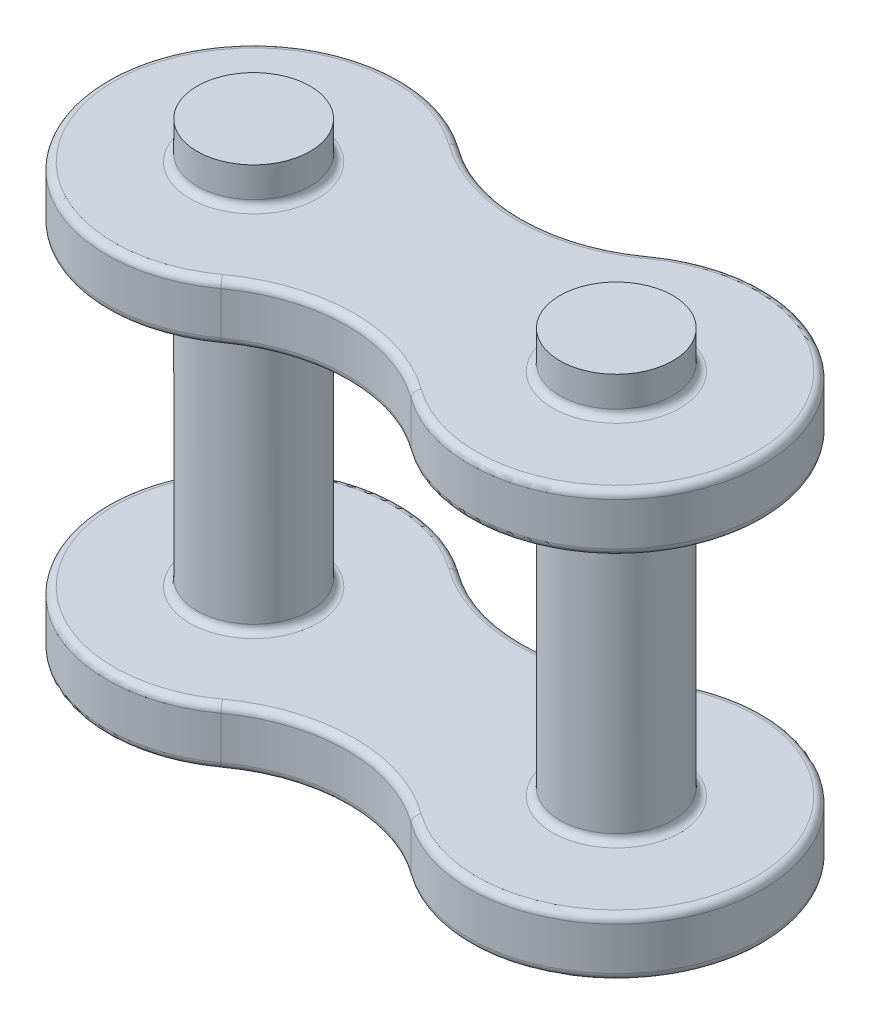
ISO-10303-21;
HEADER;
FILE_DESCRIPTION(('STEP AP214'),'2;1');
FILE_NAME('part.step','',(''),(''),'','','');
FILE_SCHEMA(('AUTOMOTIVE_DESIGN { 1 0 10303 214 1 1 1 1 }'));
ENDSEC;
DATA;
#1=APPLICATION_CONTEXT('core data for automotive mechanical design processes');
#2=APPLICATION_PROTOCOL_DEFINITION('international standard','automotive_design',2000,#1);
#3=PRODUCT_CONTEXT('',#1,'mechanical');
#4=PRODUCT('Part','Part','',(#3));
#5=PRODUCT_RELATED_PRODUCT_CATEGORY('part','',(#4));
#6=PRODUCT_DEFINITION_FORMATION('','',#4);
#7=PRODUCT_DEFINITION_CONTEXT('part definition',#1,'design');
#8=PRODUCT_DEFINITION('design','',#6,#7);
#9=PRODUCT_DEFINITION_SHAPE('','',#8);
#10=(LENGTH_UNIT() NAMED_UNIT(*) SI_UNIT(.MILLI.,.METRE.));
#11=(NAMED_UNIT(*) PLANE_ANGLE_UNIT() SI_UNIT($,.RADIAN.));
#12=(NAMED_UNIT(*) SI_UNIT($,.STERADIAN.) SOLID_ANGLE_UNIT());
#13=UNCERTAINTY_MEASURE_WITH_UNIT(LENGTH_MEASURE(1.E-05),#10,'distance_accuracy_value','');
#14=(GEOMETRIC_REPRESENTATION_CONTEXT(3) GLOBAL_UNCERTAINTY_ASSIGNED_CONTEXT((#13)) GLOBAL_UNIT_ASSIGNED_CONTEXT((#10,
#11,#12)) REPRESENTATION_CONTEXT('',''));
#15=CARTESIAN_POINT('',(0.,0.,0.));
#16=DIRECTION('',(0.,0.,1.));
#17=DIRECTION('',(1.,0.,0.));
#18=AXIS2_PLACEMENT_3D('',#15,#16,#17);
#19=CARTESIAN_POINT('',(3.175,1.0033,-4.37563141450818));
#20=DIRECTION('',(0.,1.,0.));
#21=DIRECTION('',(0.,0.,1.));
#22=AXIS2_PLACEMENT_3D('',#19,#20,#21);
#23=PLANE('',#22);
#24=CARTESIAN_POINT('',(6.35,1.0033,0.));
#25=DIRECTION('',(0.,1.,0.));
#26=DIRECTION('',(0.,0.,1.));
#27=AXIS2_PLACEMENT_3D('',#24,#25,#26);
#28=CIRCLE('',#27,2.234);
#29=CARTESIAN_POINT('',(6.35,1.0033,2.234));
#30=VERTEX_POINT('',#29);
#31=EDGE_CURVE('E278',#30,#30,#28,.F.);
#32=ORIENTED_EDGE('',*,*,#31,.T.);
#33=EDGE_LOOP('',(#32));
#34=FACE_BOUND('',#33,.T.);
#35=CARTESIAN_POINT('',(-6.35,1.0033,0.));
#36=DIRECTION('',(0.,1.,0.));
#37=DIRECTION('',(0.,0.,1.));
#38=AXIS2_PLACEMENT_3D('',#35,#36,#37);
#39=CIRCLE('',#38,2.234);
#40=CARTESIAN_POINT('',(-6.35,1.0033,2.234));
#41=VERTEX_POINT('',#40);
#42=EDGE_CURVE('E274',#41,#41,#39,.F.);
#43=ORIENTED_EDGE('',*,*,#42,.T.);
#44=EDGE_LOOP('',(#43));
#45=FACE_BOUND('',#44,.T.);
#46=CARTESIAN_POINT('',(6.35,1.0033,0.));
#47=DIRECTION('',(0.,1.,0.));
#48=DIRECTION('',(0.,0.,1.));
#49=AXIS2_PLACEMENT_3D('',#46,#47,#48);
#50=CIRCLE('',#49,4.8895);
#51=CARTESIAN_POINT('',(3.47844109205325,1.0033,3.95744357991263));
#52=VERTEX_POINT('',#51);
#53=CARTESIAN_POINT('',(3.47844109205325,1.0033,-3.95744357991263));
#54=VERTEX_POINT('',#53);
#55=EDGE_CURVE('E269',#52,#54,#50,.T.);
#56=ORIENTED_EDGE('',*,*,#55,.T.);
#57=CARTESIAN_POINT('',(0.,1.0033,-8.75126282901636));
#58=DIRECTION('',(0.,1.,0.));
#59=DIRECTION('',(0.,0.,1.));
#60=AXIS2_PLACEMENT_3D('',#57,#58,#59);
#61=CIRCLE('',#60,5.92285872058097);
#62=CARTESIAN_POINT('',(-3.47844109205325,1.0033,-3.95744357991263));
#63=VERTEX_POINT('',#62);
#64=EDGE_CURVE('E177',#54,#63,#61,.F.);
#65=ORIENTED_EDGE('',*,*,#64,.T.);
#66=CARTESIAN_POINT('',(-6.35,1.0033,0.));
#67=DIRECTION('',(0.,1.,0.));
#68=DIRECTION('',(0.,0.,1.));
#69=AXIS2_PLACEMENT_3D('',#66,#67,#68);
#70=CIRCLE('',#69,4.8895);
#71=CARTESIAN_POINT('',(-3.47844109205325,1.0033,3.95744357991263));
#72=VERTEX_POINT('',#71);
#73=EDGE_CURVE('E263',#63,#72,#70,.T.);
#74=ORIENTED_EDGE('',*,*,#73,.T.);
#75=CARTESIAN_POINT('',(0.,1.0033,8.75126282901636));
#76=DIRECTION('',(0.,1.,0.));
#77=DIRECTION('',(0.,0.,1.));
#78=AXIS2_PLACEMENT_3D('',#75,#76,#77);
#79=CIRCLE('',#78,5.92285872058097);
#80=EDGE_CURVE('E266',#72,#52,#79,.F.);
#81=ORIENTED_EDGE('',*,*,#80,.T.);
#82=EDGE_LOOP('',(#56,#65,#74,#81));
#83=FACE_BOUND('',#82,.T.);
#84=ADVANCED_FACE('F51',(#34,#45,#83),#23,.T.);
#85=CARTESIAN_POINT('',(3.175,-1.0033,-4.37563141450818));
#86=DIRECTION('',(0.,1.,0.));
#87=DIRECTION('',(0.,0.,1.));
#88=AXIS2_PLACEMENT_3D('',#85,#86,#87);
#89=PLANE('',#88);
#90=CARTESIAN_POINT('',(-6.35,-1.0033,0.));
#91=DIRECTION('',(0.,1.,0.));
#92=DIRECTION('',(0.,0.,1.));
#93=AXIS2_PLACEMENT_3D('',#90,#91,#92);
#94=CIRCLE('',#93,2.234);
#95=CARTESIAN_POINT('',(-6.35,-1.0033,2.234));
#96=VERTEX_POINT('',#95);
#97=EDGE_CURVE('E247',#96,#96,#94,.T.);
#98=ORIENTED_EDGE('',*,*,#97,.T.);
#99=EDGE_LOOP('',(#98));
#100=FACE_BOUND('',#99,.T.);
#101=CARTESIAN_POINT('',(6.35,-1.0033,0.));
#102=DIRECTION('',(0.,1.,0.));
#103=DIRECTION('',(0.,0.,1.));
#104=AXIS2_PLACEMENT_3D('',#101,#102,#103);
#105=CIRCLE('',#104,2.234);
#106=CARTESIAN_POINT('',(6.35,-1.0033,2.234));
#107=VERTEX_POINT('',#106);
#108=EDGE_CURVE('E243',#107,#107,#105,.T.);
#109=ORIENTED_EDGE('',*,*,#108,.T.);
#110=EDGE_LOOP('',(#109));
#111=FACE_BOUND('',#110,.T.);
#112=CARTESIAN_POINT('',(0.,-1.0033,-8.75126282901636));
#113=DIRECTION('',(0.,1.,0.));
#114=DIRECTION('',(0.,0.,1.));
#115=AXIS2_PLACEMENT_3D('',#112,#113,#114);
#116=CIRCLE('',#115,5.92285872058097);
#117=CARTESIAN_POINT('',(-3.47844109205325,-1.0033,-3.95744357991263));
#118=VERTEX_POINT('',#117);
#119=CARTESIAN_POINT('',(3.47844109205325,-1.0033,-3.95744357991263));
#120=VERTEX_POINT('',#119);
#121=EDGE_CURVE('E230',#118,#120,#116,.T.);
#122=ORIENTED_EDGE('',*,*,#121,.T.);
#123=CARTESIAN_POINT('',(6.35,-1.0033,0.));
#124=DIRECTION('',(0.,1.,0.));
#125=DIRECTION('',(0.,0.,1.));
#126=AXIS2_PLACEMENT_3D('',#123,#124,#125);
#127=CIRCLE('',#126,4.8895);
#128=CARTESIAN_POINT('',(3.47844109205325,-1.0033,3.95744357991263));
#129=VERTEX_POINT('',#128);
#130=EDGE_CURVE('E239',#120,#129,#127,.F.);
#131=ORIENTED_EDGE('',*,*,#130,.T.);
#132=CARTESIAN_POINT('',(0.,-1.0033,8.75126282901636));
#133=DIRECTION('',(0.,1.,0.));
#134=DIRECTION('',(0.,0.,1.));
#135=AXIS2_PLACEMENT_3D('',#132,#133,#134);
#136=CIRCLE('',#135,5.92285872058097);
#137=CARTESIAN_POINT('',(-3.47844109205325,-1.0033,3.95744357991263));
#138=VERTEX_POINT('',#137);
#139=EDGE_CURVE('E236',#129,#138,#136,.T.);
#140=ORIENTED_EDGE('',*,*,#139,.T.);
#141=CARTESIAN_POINT('',(-6.35,-1.0033,0.));
#142=DIRECTION('',(0.,1.,0.));
#143=DIRECTION('',(0.,0.,1.));
#144=AXIS2_PLACEMENT_3D('',#141,#142,#143);
#145=CIRCLE('',#144,4.8895);
#146=EDGE_CURVE('E233',#138,#118,#145,.F.);
#147=ORIENTED_EDGE('',*,*,#146,.T.);
#148=EDGE_LOOP('',(#122,#131,#140,#147));
#149=FACE_BOUND('',#148,.T.);
#150=ADVANCED_FACE('F492',(#100,#111,#149),#89,.F.);
#151=CARTESIAN_POINT('',(0.,1.0033,-8.75126282901636));
#152=DIRECTION('',(0.,-1.,0.));
#153=DIRECTION('',(0.,0.,-1.));
#154=AXIS2_PLACEMENT_3D('',#151,#152,#153);
#155=CYLINDRICAL_SURFACE('',#154,5.66885872058097);
#156=DIRECTION('',(0.,-1.,0.));
#157=VECTOR('',#156,1.);
#158=CARTESIAN_POINT('',(-3.32926920073134,1.0033,-4.16302506458341));
#159=LINE('',#158,#157);
#160=CARTESIAN_POINT('',(-3.32926920073134,0.7493,-4.16302506458341));
#161=VERTEX_POINT('',#160);
#162=CARTESIAN_POINT('',(-3.32926920073134,-0.7493,-4.16302506458341));
#163=VERTEX_POINT('',#162);
#164=EDGE_CURVE('E195',#161,#163,#159,.T.);
#165=ORIENTED_EDGE('',*,*,#164,.F.);
#166=CARTESIAN_POINT('',(0.,0.7493,-8.75126282901636));
#167=DIRECTION('',(0.,1.,0.));
#168=DIRECTION('',(0.,0.,1.));
#169=AXIS2_PLACEMENT_3D('',#166,#167,#168);
#170=CIRCLE('',#169,5.66885872058097);
#171=CARTESIAN_POINT('',(3.32926920073134,0.7493,-4.16302506458341));
#172=VERTEX_POINT('',#171);
#173=EDGE_CURVE('E174',#161,#172,#170,.T.);
#174=ORIENTED_EDGE('',*,*,#173,.T.);
#175=DIRECTION('',(0.,-1.,0.));
#176=VECTOR('',#175,1.);
#177=CARTESIAN_POINT('',(3.32926920073134,1.0033,-4.16302506458341));
#178=LINE('',#177,#176);
#179=CARTESIAN_POINT('',(3.32926920073134,-0.7493,-4.16302506458341));
#180=VERTEX_POINT('',#179);
#181=EDGE_CURVE('E201',#172,#180,#178,.T.);
#182=ORIENTED_EDGE('',*,*,#181,.T.);
#183=CARTESIAN_POINT('',(0.,-0.7493,-8.75126282901636));
#184=DIRECTION('',(0.,1.,0.));
#185=DIRECTION('',(0.,0.,1.));
#186=AXIS2_PLACEMENT_3D('',#183,#184,#185);
#187=CIRCLE('',#186,5.66885872058097);
#188=EDGE_CURVE('E205',#180,#163,#187,.F.);
#189=ORIENTED_EDGE('',*,*,#188,.T.);
#190=EDGE_LOOP('',(#165,#174,#182,#189));
#191=FACE_BOUND('',#190,.T.);
#192=ADVANCED_FACE('F200',(#191),#155,.F.);
#193=CARTESIAN_POINT('',(-6.35,1.0033,0.));
#194=DIRECTION('',(0.,-1.,0.));
#195=DIRECTION('',(0.,0.,-1.));
#196=AXIS2_PLACEMENT_3D('',#193,#194,#195);
#197=CYLINDRICAL_SURFACE('',#196,5.1435);
#198=ORIENTED_EDGE('',*,*,#164,.T.);
#199=CARTESIAN_POINT('',(-6.35,-0.7493,0.));
#200=DIRECTION('',(0.,1.,0.));
#201=DIRECTION('',(0.,0.,1.));
#202=AXIS2_PLACEMENT_3D('',#199,#200,#201);
#203=CIRCLE('',#202,5.1435);
#204=CARTESIAN_POINT('',(-3.32926920073134,-0.7493,4.16302506458341));
#205=VERTEX_POINT('',#204);
#206=EDGE_CURVE('E260',#163,#205,#203,.T.);
#207=ORIENTED_EDGE('',*,*,#206,.T.);
#208=DIRECTION('',(0.,-1.,0.));
#209=VECTOR('',#208,1.);
#210=CARTESIAN_POINT('',(-3.32926920073134,1.0033,4.16302506458341));
#211=LINE('',#210,#209);
#212=CARTESIAN_POINT('',(-3.32926920073134,0.7493,4.16302506458341));
#213=VERTEX_POINT('',#212);
#214=EDGE_CURVE('E216',#213,#205,#211,.T.);
#215=ORIENTED_EDGE('',*,*,#214,.F.);
#216=CARTESIAN_POINT('',(-6.35,0.7493,0.));
#217=DIRECTION('',(0.,1.,0.));
#218=DIRECTION('',(0.,0.,1.));
#219=AXIS2_PLACEMENT_3D('',#216,#217,#218);
#220=CIRCLE('',#219,5.1435);
#221=EDGE_CURVE('E257',#213,#161,#220,.F.);
#222=ORIENTED_EDGE('',*,*,#221,.T.);
#223=EDGE_LOOP('',(#198,#207,#215,#222));
#224=FACE_BOUND('',#223,.T.);
#225=ADVANCED_FACE('F509',(#224),#197,.T.);
#226=CARTESIAN_POINT('',(0.,1.0033,8.75126282901636));
#227=DIRECTION('',(0.,-1.,0.));
#228=DIRECTION('',(0.,0.,-1.));
#229=AXIS2_PLACEMENT_3D('',#226,#227,#228);
#230=CYLINDRICAL_SURFACE('',#229,5.66885872058097);
#231=ORIENTED_EDGE('',*,*,#214,.T.);
#232=CARTESIAN_POINT('',(0.,-0.7493,8.75126282901636));
#233=DIRECTION('',(0.,1.,0.));
#234=DIRECTION('',(0.,0.,1.));
#235=AXIS2_PLACEMENT_3D('',#232,#233,#234);
#236=CIRCLE('',#235,5.66885872058097);
#237=CARTESIAN_POINT('',(3.32926920073134,-0.7493,4.16302506458341));
#238=VERTEX_POINT('',#237);
#239=EDGE_CURVE('E254',#205,#238,#236,.F.);
#240=ORIENTED_EDGE('',*,*,#239,.T.);
#241=DIRECTION('',(0.,-1.,0.));
#242=VECTOR('',#241,1.);
#243=CARTESIAN_POINT('',(3.32926920073134,1.0033,4.16302506458341));
#244=LINE('',#243,#242);
#245=CARTESIAN_POINT('',(3.32926920073134,0.7493,4.16302506458341));
#246=VERTEX_POINT('',#245);
#247=EDGE_CURVE('E211',#246,#238,#244,.T.);
#248=ORIENTED_EDGE('',*,*,#247,.F.);
#249=CARTESIAN_POINT('',(0.,0.7493,8.75126282901636));
#250=DIRECTION('',(0.,1.,0.));
#251=DIRECTION('',(0.,0.,1.));
#252=AXIS2_PLACEMENT_3D('',#249,#250,#251);
#253=CIRCLE('',#252,5.66885872058097);
#254=EDGE_CURVE('E251',#246,#213,#253,.T.);
#255=ORIENTED_EDGE('',*,*,#254,.T.);
#256=EDGE_LOOP('',(#231,#240,#248,#255));
#257=FACE_BOUND('',#256,.T.);
#258=ADVANCED_FACE('F506',(#257),#230,.F.);
#259=CARTESIAN_POINT('',(6.35,1.0033,0.));
#260=DIRECTION('',(0.,-1.,0.));
#261=DIRECTION('',(0.,0.,-1.));
#262=AXIS2_PLACEMENT_3D('',#259,#260,#261);
#263=CYLINDRICAL_SURFACE('',#262,5.1435);
#264=ORIENTED_EDGE('',*,*,#247,.T.);
#265=CARTESIAN_POINT('',(6.35,-0.7493,0.));
#266=DIRECTION('',(0.,1.,0.));
#267=DIRECTION('',(0.,0.,1.));
#268=AXIS2_PLACEMENT_3D('',#265,#266,#267);
#269=CIRCLE('',#268,5.1435);
#270=EDGE_CURVE('E194',#238,#180,#269,.T.);
#271=ORIENTED_EDGE('',*,*,#270,.T.);
#272=ORIENTED_EDGE('',*,*,#181,.F.);
#273=CARTESIAN_POINT('',(6.35,0.7493,0.));
#274=DIRECTION('',(0.,1.,0.));
#275=DIRECTION('',(0.,0.,1.));
#276=AXIS2_PLACEMENT_3D('',#273,#274,#275);
#277=CIRCLE('',#276,5.1435);
#278=EDGE_CURVE('E185',#172,#246,#277,.F.);
#279=ORIENTED_EDGE('',*,*,#278,.T.);
#280=EDGE_LOOP('',(#264,#271,#272,#279));
#281=FACE_BOUND('',#280,.T.);
#282=ADVANCED_FACE('F208',(#281),#263,.T.);
#283=CARTESIAN_POINT('',(-6.35,-2.3114,0.));
#284=DIRECTION('',(0.,1.,0.));
#285=DIRECTION('',(0.,0.,1.));
#286=AXIS2_PLACEMENT_3D('',#283,#284,#285);
#287=PLANE('',#286);
#288=CARTESIAN_POINT('',(-6.35,-2.3114,0.));
#289=DIRECTION('',(0.,1.,0.));
#290=DIRECTION('',(0.,0.,1.));
#291=AXIS2_PLACEMENT_3D('',#288,#289,#290);
#292=CIRCLE('',#291,1.98);
#293=CARTESIAN_POINT('',(-6.35,-2.3114,1.98));
#294=VERTEX_POINT('',#293);
#295=EDGE_CURVE('E219',#294,#294,#292,.T.);
#296=ORIENTED_EDGE('',*,*,#295,.F.);
#297=EDGE_LOOP('',(#296));
#298=FACE_BOUND('',#297,.T.);
#299=ADVANCED_FACE('F505',(#298),#287,.F.);
#300=CARTESIAN_POINT('',(-6.35,15.1892,0.));
#301=DIRECTION('',(0.,-1.,0.));
#302=DIRECTION('',(0.,0.,-1.));
#303=AXIS2_PLACEMENT_3D('',#300,#301,#302);
#304=CYLINDRICAL_SURFACE('',#303,1.98);
#305=CARTESIAN_POINT('',(-6.35,-1.2573,0.));
#306=DIRECTION('',(0.,1.,0.));
#307=DIRECTION('',(0.,0.,1.));
#308=AXIS2_PLACEMENT_3D('',#305,#306,#307);
#309=CIRCLE('',#308,1.98);
#310=CARTESIAN_POINT('',(-6.35,-1.2573,1.98));
#311=VERTEX_POINT('',#310);
#312=EDGE_CURVE('E204',#311,#311,#309,.F.);
#313=ORIENTED_EDGE('',*,*,#312,.T.);
#314=EDGE_LOOP('',(#313));
#315=FACE_BOUND('',#314,.T.);
#316=ORIENTED_EDGE('',*,*,#295,.T.);
#317=EDGE_LOOP('',(#316));
#318=FACE_BOUND('',#317,.T.);
#319=ADVANCED_FACE('F486',(#315,#318),#304,.T.);
#320=CARTESIAN_POINT('',(-6.35,11.6205,0.));
#321=DIRECTION('',(0.,-1.,0.));
#322=DIRECTION('',(0.,0.,-1.));
#323=AXIS2_PLACEMENT_3D('',#320,#321,#322);
#324=CIRCLE('',#323,1.98);
#325=CARTESIAN_POINT('',(-6.35,11.6205,-1.98));
#326=VERTEX_POINT('',#325);
#327=EDGE_CURVE('E11',#326,#326,#324,.T.);
#328=ORIENTED_EDGE('',*,*,#327,.T.);
#329=EDGE_LOOP('',(#328));
#330=FACE_BOUND('',#329,.T.);
#331=CARTESIAN_POINT('',(-6.35,1.2573,0.));
#332=DIRECTION('',(0.,1.,0.));
#333=DIRECTION('',(0.,0.,1.));
#334=AXIS2_PLACEMENT_3D('',#331,#332,#333);
#335=CIRCLE('',#334,1.98);
#336=CARTESIAN_POINT('',(-6.35,1.2573,1.98));
#337=VERTEX_POINT('',#336);
#338=EDGE_CURVE('E295',#337,#337,#335,.T.);
#339=ORIENTED_EDGE('',*,*,#338,.T.);
#340=EDGE_LOOP('',(#339));
#341=FACE_BOUND('',#340,.T.);
#342=ADVANCED_FACE('F474',(#330,#341),#304,.T.);
#343=CARTESIAN_POINT('',(6.35,-2.3114,0.));
#344=DIRECTION('',(0.,-1.,0.));
#345=DIRECTION('',(0.,0.,-1.));
#346=AXIS2_PLACEMENT_3D('',#343,#344,#345);
#347=PLANE('',#346);
#348=CARTESIAN_POINT('',(6.35,-2.3114,0.));
#349=DIRECTION('',(0.,1.,0.));
#350=DIRECTION('',(0.,0.,-1.));
#351=AXIS2_PLACEMENT_3D('',#348,#349,#350);
#352=CIRCLE('',#351,1.98);
#353=CARTESIAN_POINT('',(6.35,-2.3114,-1.98));
#354=VERTEX_POINT('',#353);
#355=EDGE_CURVE('E314',#354,#354,#352,.T.);
#356=ORIENTED_EDGE('',*,*,#355,.F.);
#357=EDGE_LOOP('',(#356));
#358=FACE_BOUND('',#357,.T.);
#359=ADVANCED_FACE('F472',(#358),#347,.T.);
#360=CARTESIAN_POINT('',(6.35,15.1892,0.));
#361=DIRECTION('',(0.,-1.,0.));
#362=DIRECTION('',(0.,0.,-1.));
#363=AXIS2_PLACEMENT_3D('',#360,#361,#362);
#364=CYLINDRICAL_SURFACE('',#363,1.98);
#365=CARTESIAN_POINT('',(6.35,-1.2573,0.));
#366=DIRECTION('',(0.,1.,0.));
#367=DIRECTION('',(0.,0.,1.));
#368=AXIS2_PLACEMENT_3D('',#365,#366,#367);
#369=CIRCLE('',#368,1.98);
#370=CARTESIAN_POINT('',(6.35,-1.2573,1.98));
#371=VERTEX_POINT('',#370);
#372=EDGE_CURVE('E287',#371,#371,#369,.F.);
#373=ORIENTED_EDGE('',*,*,#372,.T.);
#374=EDGE_LOOP('',(#373));
#375=FACE_BOUND('',#374,.T.);
#376=ORIENTED_EDGE('',*,*,#355,.T.);
#377=EDGE_LOOP('',(#376));
#378=FACE_BOUND('',#377,.T.);
#379=ADVANCED_FACE('F470',(#375,#378),#364,.T.);
#380=CARTESIAN_POINT('',(6.35,11.6205,0.));
#381=DIRECTION('',(0.,-1.,0.));
#382=DIRECTION('',(0.,0.,-1.));
#383=AXIS2_PLACEMENT_3D('',#380,#381,#382);
#384=CIRCLE('',#383,1.98);
#385=CARTESIAN_POINT('',(6.35,11.6205,-1.98));
#386=VERTEX_POINT('',#385);
#387=EDGE_CURVE('E61',#386,#386,#384,.T.);
#388=ORIENTED_EDGE('',*,*,#387,.T.);
#389=EDGE_LOOP('',(#388));
#390=FACE_BOUND('',#389,.T.);
#391=CARTESIAN_POINT('',(6.35,1.2573,0.));
#392=DIRECTION('',(0.,1.,0.));
#393=DIRECTION('',(0.,0.,1.));
#394=AXIS2_PLACEMENT_3D('',#391,#392,#393);
#395=CIRCLE('',#394,1.98);
#396=CARTESIAN_POINT('',(6.35,1.2573,1.98));
#397=VERTEX_POINT('',#396);
#398=EDGE_CURVE('E291',#397,#397,#395,.T.);
#399=ORIENTED_EDGE('',*,*,#398,.T.);
#400=EDGE_LOOP('',(#399));
#401=FACE_BOUND('',#400,.T.);
#402=ADVANCED_FACE('F481',(#390,#401),#364,.T.);
#403=CARTESIAN_POINT('',(-6.35,-0.7493,0.));
#404=DIRECTION('',(0.,1.,0.));
#405=DIRECTION('',(0.,0.,1.));
#406=AXIS2_PLACEMENT_3D('',#403,#404,#405);
#407=TOROIDAL_SURFACE('',#406,4.8895,0.254);
#408=CARTESIAN_POINT('',(-3.47844109205325,-0.7493,-3.95744357991263));
#409=DIRECTION('',(0.809375923900732,0.,0.587290910716177));
#410=DIRECTION('',(0.587290910716177,0.,-0.809375923900732));
#411=AXIS2_PLACEMENT_3D('',#408,#409,#410);
#412=CIRCLE('',#411,0.254);
#413=EDGE_CURVE('E306',#118,#163,#412,.T.);
#414=ORIENTED_EDGE('',*,*,#413,.F.);
#415=ORIENTED_EDGE('',*,*,#146,.F.);
#416=CARTESIAN_POINT('',(-3.47844109205325,-0.7493,3.95744357991263));
#417=DIRECTION('',(0.809375923900732,0.,-0.587290910716177));
#418=DIRECTION('',(-0.587290910716177,0.,-0.809375923900732));
#419=AXIS2_PLACEMENT_3D('',#416,#417,#418);
#420=CIRCLE('',#419,0.254);
#421=EDGE_CURVE('E310',#205,#138,#420,.T.);
#422=ORIENTED_EDGE('',*,*,#421,.F.);
#423=ORIENTED_EDGE('',*,*,#206,.F.);
#424=EDGE_LOOP('',(#414,#415,#422,#423));
#425=FACE_BOUND('',#424,.T.);
#426=ADVANCED_FACE('F528',(#425),#407,.T.);
#427=CARTESIAN_POINT('',(0.,-0.7493,8.75126282901636));
#428=DIRECTION('',(0.,1.,0.));
#429=DIRECTION('',(0.,0.,1.));
#430=AXIS2_PLACEMENT_3D('',#427,#428,#429);
#431=TOROIDAL_SURFACE('',#430,5.92285872058097,0.254);
#432=ORIENTED_EDGE('',*,*,#421,.T.);
#433=ORIENTED_EDGE('',*,*,#139,.F.);
#434=CARTESIAN_POINT('',(3.47844109205325,-0.7493,3.95744357991263));
#435=DIRECTION('',(0.809375923900732,0.,0.587290910716177));
#436=DIRECTION('',(0.587290910716177,0.,-0.809375923900732));
#437=AXIS2_PLACEMENT_3D('',#434,#435,#436);
#438=CIRCLE('',#437,0.254);
#439=EDGE_CURVE('E303',#238,#129,#438,.T.);
#440=ORIENTED_EDGE('',*,*,#439,.F.);
#441=ORIENTED_EDGE('',*,*,#239,.F.);
#442=EDGE_LOOP('',(#432,#433,#440,#441));
#443=FACE_BOUND('',#442,.T.);
#444=ADVANCED_FACE('F524',(#443),#431,.T.);
#445=CARTESIAN_POINT('',(0.,-0.7493,-8.75126282901636));
#446=DIRECTION('',(0.,1.,0.));
#447=DIRECTION('',(0.,0.,1.));
#448=AXIS2_PLACEMENT_3D('',#445,#446,#447);
#449=TOROIDAL_SURFACE('',#448,5.92285872058097,0.254);
#450=ORIENTED_EDGE('',*,*,#413,.T.);
#451=ORIENTED_EDGE('',*,*,#188,.F.);
#452=CARTESIAN_POINT('',(3.47844109205325,-0.7493,-3.95744357991263));
#453=DIRECTION('',(0.809375923900732,0.,-0.587290910716177));
#454=DIRECTION('',(-0.587290910716177,0.,-0.809375923900732));
#455=AXIS2_PLACEMENT_3D('',#452,#453,#454);
#456=CIRCLE('',#455,0.254);
#457=EDGE_CURVE('E300',#120,#180,#456,.T.);
#458=ORIENTED_EDGE('',*,*,#457,.F.);
#459=ORIENTED_EDGE('',*,*,#121,.F.);
#460=EDGE_LOOP('',(#450,#451,#458,#459));
#461=FACE_BOUND('',#460,.T.);
#462=ADVANCED_FACE('F520',(#461),#449,.T.);
#463=CARTESIAN_POINT('',(6.35,-0.7493,0.));
#464=DIRECTION('',(0.,1.,0.));
#465=DIRECTION('',(0.,0.,1.));
#466=AXIS2_PLACEMENT_3D('',#463,#464,#465);
#467=TOROIDAL_SURFACE('',#466,4.8895,0.254);
#468=ORIENTED_EDGE('',*,*,#439,.T.);
#469=ORIENTED_EDGE('',*,*,#130,.F.);
#470=ORIENTED_EDGE('',*,*,#457,.T.);
#471=ORIENTED_EDGE('',*,*,#270,.F.);
#472=EDGE_LOOP('',(#468,#469,#470,#471));
#473=FACE_BOUND('',#472,.T.);
#474=ADVANCED_FACE('F516',(#473),#467,.T.);
#475=CARTESIAN_POINT('',(0.,0.7493,8.75126282901636));
#476=DIRECTION('',(0.,1.,0.));
#477=DIRECTION('',(0.,0.,1.));
#478=AXIS2_PLACEMENT_3D('',#475,#476,#477);
#479=TOROIDAL_SURFACE('',#478,5.92285872058097,0.254);
#480=CARTESIAN_POINT('',(-3.47844109205325,0.7493,3.95744357991263));
#481=DIRECTION('',(-0.809375923900732,0.,0.587290910716177));
#482=DIRECTION('',(0.587290910716177,0.,0.809375923900732));
#483=AXIS2_PLACEMENT_3D('',#480,#481,#482);
#484=CIRCLE('',#483,0.254);
#485=EDGE_CURVE('E181',#213,#72,#484,.T.);
#486=ORIENTED_EDGE('',*,*,#485,.F.);
#487=ORIENTED_EDGE('',*,*,#254,.F.);
#488=CARTESIAN_POINT('',(3.47844109205325,0.7493,3.95744357991263));
#489=DIRECTION('',(0.809375923900732,0.,0.587290910716177));
#490=DIRECTION('',(0.587290910716177,0.,-0.809375923900732));
#491=AXIS2_PLACEMENT_3D('',#488,#489,#490);
#492=CIRCLE('',#491,0.254);
#493=EDGE_CURVE('E188',#52,#246,#492,.T.);
#494=ORIENTED_EDGE('',*,*,#493,.F.);
#495=ORIENTED_EDGE('',*,*,#80,.F.);
#496=EDGE_LOOP('',(#486,#487,#494,#495));
#497=FACE_BOUND('',#496,.T.);
#498=ADVANCED_FACE('F519',(#497),#479,.T.);
#499=CARTESIAN_POINT('',(6.35,0.7493,0.));
#500=DIRECTION('',(0.,1.,0.));
#501=DIRECTION('',(0.,0.,1.));
#502=AXIS2_PLACEMENT_3D('',#499,#500,#501);
#503=TOROIDAL_SURFACE('',#502,4.8895,0.254);
#504=ORIENTED_EDGE('',*,*,#493,.T.);
#505=ORIENTED_EDGE('',*,*,#278,.F.);
#506=CARTESIAN_POINT('',(3.47844109205325,0.7493,-3.95744357991263));
#507=DIRECTION('',(-0.809375923900731,0.,0.587290910716178));
#508=DIRECTION('',(0.587290910716178,0.,0.809375923900731));
#509=AXIS2_PLACEMENT_3D('',#506,#507,#508);
#510=CIRCLE('',#509,0.254);
#511=EDGE_CURVE('E170',#54,#172,#510,.T.);
#512=ORIENTED_EDGE('',*,*,#511,.F.);
#513=ORIENTED_EDGE('',*,*,#55,.F.);
#514=EDGE_LOOP('',(#504,#505,#512,#513));
#515=FACE_BOUND('',#514,.T.);
#516=ADVANCED_FACE('F186',(#515),#503,.T.);
#517=CARTESIAN_POINT('',(-6.35,0.7493,0.));
#518=DIRECTION('',(0.,1.,0.));
#519=DIRECTION('',(0.,0.,1.));
#520=AXIS2_PLACEMENT_3D('',#517,#518,#519);
#521=TOROIDAL_SURFACE('',#520,4.8895,0.254);
#522=ORIENTED_EDGE('',*,*,#485,.T.);
#523=ORIENTED_EDGE('',*,*,#73,.F.);
#524=CARTESIAN_POINT('',(-3.47844109205325,0.7493,-3.95744357991263));
#525=DIRECTION('',(0.809375923900732,0.,0.587290910716177));
#526=DIRECTION('',(0.587290910716177,0.,-0.809375923900732));
#527=AXIS2_PLACEMENT_3D('',#524,#525,#526);
#528=CIRCLE('',#527,0.254);
#529=EDGE_CURVE('E182',#161,#63,#528,.T.);
#530=ORIENTED_EDGE('',*,*,#529,.F.);
#531=ORIENTED_EDGE('',*,*,#221,.F.);
#532=EDGE_LOOP('',(#522,#523,#530,#531));
#533=FACE_BOUND('',#532,.T.);
#534=ADVANCED_FACE('F536',(#533),#521,.T.);
#535=CARTESIAN_POINT('',(0.,0.7493,-8.75126282901636));
#536=DIRECTION('',(0.,1.,0.));
#537=DIRECTION('',(0.,0.,1.));
#538=AXIS2_PLACEMENT_3D('',#535,#536,#537);
#539=TOROIDAL_SURFACE('',#538,5.92285872058097,0.254);
#540=ORIENTED_EDGE('',*,*,#511,.T.);
#541=ORIENTED_EDGE('',*,*,#173,.F.);
#542=ORIENTED_EDGE('',*,*,#529,.T.);
#543=ORIENTED_EDGE('',*,*,#64,.F.);
#544=EDGE_LOOP('',(#540,#541,#542,#543));
#545=FACE_BOUND('',#544,.T.);
#546=ADVANCED_FACE('F172',(#545),#539,.T.);
#547=CARTESIAN_POINT('',(-6.35,-1.2573,0.));
#548=DIRECTION('',(0.,1.,0.));
#549=DIRECTION('',(0.,0.,1.));
#550=AXIS2_PLACEMENT_3D('',#547,#548,#549);
#551=TOROIDAL_SURFACE('',#550,2.234,0.254);
#552=ORIENTED_EDGE('',*,*,#97,.F.);
#553=EDGE_LOOP('',(#552));
#554=FACE_BOUND('',#553,.T.);
#555=ORIENTED_EDGE('',*,*,#312,.F.);
#556=EDGE_LOOP('',(#555));
#557=FACE_BOUND('',#556,.T.);
#558=ADVANCED_FACE('F535',(#554,#557),#551,.F.);
#559=CARTESIAN_POINT('',(6.35,-1.2573,0.));
#560=DIRECTION('',(0.,1.,0.));
#561=DIRECTION('',(0.,0.,1.));
#562=AXIS2_PLACEMENT_3D('',#559,#560,#561);
#563=TOROIDAL_SURFACE('',#562,2.234,0.254);
#564=ORIENTED_EDGE('',*,*,#108,.F.);
#565=EDGE_LOOP('',(#564));
#566=FACE_BOUND('',#565,.T.);
#567=ORIENTED_EDGE('',*,*,#372,.F.);
#568=EDGE_LOOP('',(#567));
#569=FACE_BOUND('',#568,.T.);
#570=ADVANCED_FACE('F547',(#566,#569),#563,.F.);
#571=CARTESIAN_POINT('',(6.35,1.2573,0.));
#572=DIRECTION('',(0.,1.,0.));
#573=DIRECTION('',(0.,0.,1.));
#574=AXIS2_PLACEMENT_3D('',#571,#572,#573);
#575=TOROIDAL_SURFACE('',#574,2.234,0.254);
#576=ORIENTED_EDGE('',*,*,#31,.F.);
#577=EDGE_LOOP('',(#576));
#578=FACE_BOUND('',#577,.T.);
#579=ORIENTED_EDGE('',*,*,#398,.F.);
#580=EDGE_LOOP('',(#579));
#581=FACE_BOUND('',#580,.T.);
#582=ADVANCED_FACE('F551',(#578,#581),#575,.F.);
#583=CARTESIAN_POINT('',(-6.35,1.2573,0.));
#584=DIRECTION('',(0.,1.,0.));
#585=DIRECTION('',(0.,0.,1.));
#586=AXIS2_PLACEMENT_3D('',#583,#584,#585);
#587=TOROIDAL_SURFACE('',#586,2.234,0.254);
#588=ORIENTED_EDGE('',*,*,#42,.F.);
#589=EDGE_LOOP('',(#588));
#590=FACE_BOUND('',#589,.T.);
#591=ORIENTED_EDGE('',*,*,#338,.F.);
#592=EDGE_LOOP('',(#591));
#593=FACE_BOUND('',#592,.T.);
#594=ADVANCED_FACE('F555',(#590,#593),#587,.F.);
#595=CARTESIAN_POINT('',(0.,11.8745,-8.75126282901636));
#596=DIRECTION('',(0.,1.,0.));
#597=DIRECTION('',(0.,0.,1.));
#598=AXIS2_PLACEMENT_3D('',#595,#596,#597);
#599=CYLINDRICAL_SURFACE('',#598,5.66885872058097);
#600=DIRECTION('',(0.,1.,0.));
#601=VECTOR('',#600,1.);
#602=CARTESIAN_POINT('',(3.32926920073134,11.8745,-4.16302506458341));
#603=LINE('',#602,#601);
#604=CARTESIAN_POINT('',(3.32926920073134,12.1285,-4.16302506458341));
#605=VERTEX_POINT('',#604);
#606=CARTESIAN_POINT('',(3.32926920073134,13.6271,-4.16302506458341));
#607=VERTEX_POINT('',#606);
#608=EDGE_CURVE('E316',#605,#607,#603,.T.);
#609=ORIENTED_EDGE('',*,*,#608,.F.);
#610=CARTESIAN_POINT('',(0.,12.1285,-8.75126282901636));
#611=DIRECTION('',(0.,-1.,0.));
#612=DIRECTION('',(0.,0.,-1.));
#613=AXIS2_PLACEMENT_3D('',#610,#611,#612);
#614=CIRCLE('',#613,5.66885872058097);
#615=CARTESIAN_POINT('',(-3.32926920073134,12.1285,-4.16302506458341));
#616=VERTEX_POINT('',#615);
#617=EDGE_CURVE('E365',#605,#616,#614,.T.);
#618=ORIENTED_EDGE('',*,*,#617,.T.);
#619=DIRECTION('',(0.,1.,0.));
#620=VECTOR('',#619,1.);
#621=CARTESIAN_POINT('',(-3.32926920073134,11.8745,-4.16302506458341));
#622=LINE('',#621,#620);
#623=CARTESIAN_POINT('',(-3.32926920073134,13.6271,-4.16302506458341));
#624=VERTEX_POINT('',#623);
#625=EDGE_CURVE('E413',#616,#624,#622,.T.);
#626=ORIENTED_EDGE('',*,*,#625,.T.);
#627=CARTESIAN_POINT('',(0.,13.6271,-8.75126282901636));
#628=DIRECTION('',(0.,-1.,0.));
#629=DIRECTION('',(0.,0.,-1.));
#630=AXIS2_PLACEMENT_3D('',#627,#628,#629);
#631=CIRCLE('',#630,5.66885872058097);
#632=EDGE_CURVE('E362',#624,#607,#631,.F.);
#633=ORIENTED_EDGE('',*,*,#632,.T.);
#634=EDGE_LOOP('',(#609,#618,#626,#633));
#635=FACE_BOUND('',#634,.T.);
#636=ADVANCED_FACE('F445',(#635),#599,.F.);
#637=CARTESIAN_POINT('',(6.35,11.8745,0.));
#638=DIRECTION('',(0.,1.,0.));
#639=DIRECTION('',(0.,0.,1.));
#640=AXIS2_PLACEMENT_3D('',#637,#638,#639);
#641=CYLINDRICAL_SURFACE('',#640,5.1435);
#642=ORIENTED_EDGE('',*,*,#608,.T.);
#643=CARTESIAN_POINT('',(6.35,13.6271,0.));
#644=DIRECTION('',(0.,-1.,0.));
#645=DIRECTION('',(0.,0.,-1.));
#646=AXIS2_PLACEMENT_3D('',#643,#644,#645);
#647=CIRCLE('',#646,5.1435);
#648=CARTESIAN_POINT('',(3.32926920073134,13.6271,4.16302506458341));
#649=VERTEX_POINT('',#648);
#650=EDGE_CURVE('E346',#607,#649,#647,.T.);
#651=ORIENTED_EDGE('',*,*,#650,.T.);
#652=DIRECTION('',(0.,1.,0.));
#653=VECTOR('',#652,1.);
#654=CARTESIAN_POINT('',(3.32926920073134,11.8745,4.16302506458341));
#655=LINE('',#654,#653);
#656=CARTESIAN_POINT('',(3.32926920073134,12.1285,4.16302506458341));
#657=VERTEX_POINT('',#656);
#658=EDGE_CURVE('E454',#657,#649,#655,.T.);
#659=ORIENTED_EDGE('',*,*,#658,.F.);
#660=CARTESIAN_POINT('',(6.35,12.1285,0.));
#661=DIRECTION('',(0.,-1.,0.));
#662=DIRECTION('',(0.,0.,-1.));
#663=AXIS2_PLACEMENT_3D('',#660,#661,#662);
#664=CIRCLE('',#663,5.1435);
#665=EDGE_CURVE('E343',#657,#605,#664,.F.);
#666=ORIENTED_EDGE('',*,*,#665,.T.);
#667=EDGE_LOOP('',(#642,#651,#659,#666));
#668=FACE_BOUND('',#667,.T.);
#669=ADVANCED_FACE('F620',(#668),#641,.T.);
#670=CARTESIAN_POINT('',(0.,11.8745,8.75126282901636));
#671=DIRECTION('',(0.,1.,0.));
#672=DIRECTION('',(0.,0.,1.));
#673=AXIS2_PLACEMENT_3D('',#670,#671,#672);
#674=CYLINDRICAL_SURFACE('',#673,5.66885872058097);
#675=ORIENTED_EDGE('',*,*,#658,.T.);
#676=CARTESIAN_POINT('',(0.,13.6271,8.75126282901636));
#677=DIRECTION('',(0.,-1.,0.));
#678=DIRECTION('',(0.,0.,-1.));
#679=AXIS2_PLACEMENT_3D('',#676,#677,#678);
#680=CIRCLE('',#679,5.66885872058097);
#681=CARTESIAN_POINT('',(-3.32926920073134,13.6271,4.16302506458341));
#682=VERTEX_POINT('',#681);
#683=EDGE_CURVE('E353',#649,#682,#680,.F.);
#684=ORIENTED_EDGE('',*,*,#683,.T.);
#685=DIRECTION('',(0.,1.,0.));
#686=VECTOR('',#685,1.);
#687=CARTESIAN_POINT('',(-3.32926920073134,11.8745,4.16302506458341));
#688=LINE('',#687,#686);
#689=CARTESIAN_POINT('',(-3.32926920073134,12.1285,4.16302506458341));
#690=VERTEX_POINT('',#689);
#691=EDGE_CURVE('E451',#690,#682,#688,.T.);
#692=ORIENTED_EDGE('',*,*,#691,.F.);
#693=CARTESIAN_POINT('',(0.,12.1285,8.75126282901636));
#694=DIRECTION('',(0.,-1.,0.));
#695=DIRECTION('',(0.,0.,-1.));
#696=AXIS2_PLACEMENT_3D('',#693,#694,#695);
#697=CIRCLE('',#696,5.66885872058097);
#698=EDGE_CURVE('E350',#690,#657,#697,.T.);
#699=ORIENTED_EDGE('',*,*,#698,.T.);
#700=EDGE_LOOP('',(#675,#684,#692,#699));
#701=FACE_BOUND('',#700,.T.);
#702=ADVANCED_FACE('F615',(#701),#674,.F.);
#703=CARTESIAN_POINT('',(-6.35,11.8745,0.));
#704=DIRECTION('',(0.,1.,0.));
#705=DIRECTION('',(0.,0.,1.));
#706=AXIS2_PLACEMENT_3D('',#703,#704,#705);
#707=CYLINDRICAL_SURFACE('',#706,5.1435);
#708=ORIENTED_EDGE('',*,*,#691,.T.);
#709=CARTESIAN_POINT('',(-6.35,13.6271,0.));
#710=DIRECTION('',(0.,-1.,0.));
#711=DIRECTION('',(0.,0.,-1.));
#712=AXIS2_PLACEMENT_3D('',#709,#710,#711);
#713=CIRCLE('',#712,5.1435);
#714=EDGE_CURVE('E359',#682,#624,#713,.T.);
#715=ORIENTED_EDGE('',*,*,#714,.T.);
#716=ORIENTED_EDGE('',*,*,#625,.F.);
#717=CARTESIAN_POINT('',(-6.35,12.1285,0.));
#718=DIRECTION('',(0.,-1.,0.));
#719=DIRECTION('',(0.,0.,-1.));
#720=AXIS2_PLACEMENT_3D('',#717,#718,#719);
#721=CIRCLE('',#720,5.1435);
#722=EDGE_CURVE('E356',#616,#690,#721,.F.);
#723=ORIENTED_EDGE('',*,*,#722,.T.);
#724=EDGE_LOOP('',(#708,#715,#716,#723));
#725=FACE_BOUND('',#724,.T.);
#726=ADVANCED_FACE('F448',(#725),#707,.T.);
#727=CARTESIAN_POINT('',(3.175,11.8745,-4.37563141450818));
#728=DIRECTION('',(0.,-1.,0.));
#729=DIRECTION('',(0.,0.,1.));
#730=AXIS2_PLACEMENT_3D('',#727,#728,#729);
#731=PLANE('',#730);
#732=CARTESIAN_POINT('',(6.35,11.8745,0.));
#733=DIRECTION('',(0.,-1.,0.));
#734=DIRECTION('',(0.,0.,-1.));
#735=AXIS2_PLACEMENT_3D('',#732,#733,#734);
#736=CIRCLE('',#735,2.234);
#737=CARTESIAN_POINT('',(6.35,11.8745,-2.234));
#738=VERTEX_POINT('',#737);
#739=EDGE_CURVE('E384',#738,#738,#736,.F.);
#740=ORIENTED_EDGE('',*,*,#739,.T.);
#741=EDGE_LOOP('',(#740));
#742=FACE_BOUND('',#741,.T.);
#743=CARTESIAN_POINT('',(-6.35,11.8745,0.));
#744=DIRECTION('',(0.,-1.,0.));
#745=DIRECTION('',(0.,0.,-1.));
#746=AXIS2_PLACEMENT_3D('',#743,#744,#745);
#747=CIRCLE('',#746,2.234);
#748=CARTESIAN_POINT('',(-6.35,11.8745,-2.234));
#749=VERTEX_POINT('',#748);
#750=EDGE_CURVE('E380',#749,#749,#747,.F.);
#751=ORIENTED_EDGE('',*,*,#750,.T.);
#752=EDGE_LOOP('',(#751));
#753=FACE_BOUND('',#752,.T.);
#754=CARTESIAN_POINT('',(-6.35,11.8745,0.));
#755=DIRECTION('',(0.,-1.,0.));
#756=DIRECTION('',(0.,0.,-1.));
#757=AXIS2_PLACEMENT_3D('',#754,#755,#756);
#758=CIRCLE('',#757,4.8895);
#759=CARTESIAN_POINT('',(-3.47844109205325,11.8745,3.95744357991263));
#760=VERTEX_POINT('',#759);
#761=CARTESIAN_POINT('',(-3.47844109205325,11.8745,-3.95744357991263));
#762=VERTEX_POINT('',#761);
#763=EDGE_CURVE('E369',#760,#762,#758,.T.);
#764=ORIENTED_EDGE('',*,*,#763,.T.);
#765=CARTESIAN_POINT('',(0.,11.8745,-8.75126282901636));
#766=DIRECTION('',(0.,-1.,0.));
#767=DIRECTION('',(0.,0.,-1.));
#768=AXIS2_PLACEMENT_3D('',#765,#766,#767);
#769=CIRCLE('',#768,5.92285872058097);
#770=CARTESIAN_POINT('',(3.47844109205325,11.8745,-3.95744357991263));
#771=VERTEX_POINT('',#770);
#772=EDGE_CURVE('E377',#762,#771,#769,.F.);
#773=ORIENTED_EDGE('',*,*,#772,.T.);
#774=CARTESIAN_POINT('',(6.35,11.8745,0.));
#775=DIRECTION('',(0.,-1.,0.));
#776=DIRECTION('',(0.,0.,-1.));
#777=AXIS2_PLACEMENT_3D('',#774,#775,#776);
#778=CIRCLE('',#777,4.8895);
#779=CARTESIAN_POINT('',(3.47844109205325,11.8745,3.95744357991263));
#780=VERTEX_POINT('',#779);
#781=EDGE_CURVE('E76',#771,#780,#778,.T.);
#782=ORIENTED_EDGE('',*,*,#781,.T.);
#783=CARTESIAN_POINT('',(0.,11.8745,8.75126282901636));
#784=DIRECTION('',(0.,-1.,0.));
#785=DIRECTION('',(0.,0.,-1.));
#786=AXIS2_PLACEMENT_3D('',#783,#784,#785);
#787=CIRCLE('',#786,5.92285872058097);
#788=EDGE_CURVE('E372',#780,#760,#787,.F.);
#789=ORIENTED_EDGE('',*,*,#788,.T.);
#790=EDGE_LOOP('',(#764,#773,#782,#789));
#791=FACE_BOUND('',#790,.T.);
#792=ADVANCED_FACE('F434',(#742,#753,#791),#731,.T.);
#793=CARTESIAN_POINT('',(3.175,13.8811,-4.37563141450818));
#794=DIRECTION('',(0.,-1.,0.));
#795=DIRECTION('',(0.,0.,1.));
#796=AXIS2_PLACEMENT_3D('',#793,#794,#795);
#797=PLANE('',#796);
#798=CARTESIAN_POINT('',(-6.35,13.8811,0.));
#799=DIRECTION('',(0.,-1.,0.));
#800=DIRECTION('',(0.,0.,-1.));
#801=AXIS2_PLACEMENT_3D('',#798,#799,#800);
#802=CIRCLE('',#801,2.234);
#803=CARTESIAN_POINT('',(-6.35,13.8811,-2.234));
#804=VERTEX_POINT('',#803);
#805=EDGE_CURVE('E339',#804,#804,#802,.T.);
#806=ORIENTED_EDGE('',*,*,#805,.T.);
#807=EDGE_LOOP('',(#806));
#808=FACE_BOUND('',#807,.T.);
#809=CARTESIAN_POINT('',(6.35,13.8811,0.));
#810=DIRECTION('',(0.,-1.,0.));
#811=DIRECTION('',(0.,0.,-1.));
#812=AXIS2_PLACEMENT_3D('',#809,#810,#811);
#813=CIRCLE('',#812,2.234);
#814=CARTESIAN_POINT('',(6.35,13.8811,-2.234));
#815=VERTEX_POINT('',#814);
#816=EDGE_CURVE('E335',#815,#815,#813,.T.);
#817=ORIENTED_EDGE('',*,*,#816,.T.);
#818=EDGE_LOOP('',(#817));
#819=FACE_BOUND('',#818,.T.);
#820=CARTESIAN_POINT('',(0.,13.8811,8.75126282901636));
#821=DIRECTION('',(0.,-1.,0.));
#822=DIRECTION('',(0.,0.,-1.));
#823=AXIS2_PLACEMENT_3D('',#820,#821,#822);
#824=CIRCLE('',#823,5.92285872058097);
#825=CARTESIAN_POINT('',(-3.47844109205325,13.8811,3.95744357991263));
#826=VERTEX_POINT('',#825);
#827=CARTESIAN_POINT('',(3.47844109205325,13.8811,3.95744357991263));
#828=VERTEX_POINT('',#827);
#829=EDGE_CURVE('E328',#826,#828,#824,.T.);
#830=ORIENTED_EDGE('',*,*,#829,.T.);
#831=CARTESIAN_POINT('',(6.35,13.8811,0.));
#832=DIRECTION('',(0.,-1.,0.));
#833=DIRECTION('',(0.,0.,-1.));
#834=AXIS2_PLACEMENT_3D('',#831,#832,#833);
#835=CIRCLE('',#834,4.8895);
#836=CARTESIAN_POINT('',(3.47844109205325,13.8811,-3.95744357991263));
#837=VERTEX_POINT('',#836);
#838=EDGE_CURVE('E331',#828,#837,#835,.F.);
#839=ORIENTED_EDGE('',*,*,#838,.T.);
#840=CARTESIAN_POINT('',(0.,13.8811,-8.75126282901636));
#841=DIRECTION('',(0.,-1.,0.));
#842=DIRECTION('',(0.,0.,-1.));
#843=AXIS2_PLACEMENT_3D('',#840,#841,#842);
#844=CIRCLE('',#843,5.92285872058097);
#845=CARTESIAN_POINT('',(-3.47844109205325,13.8811,-3.95744357991263));
#846=VERTEX_POINT('',#845);
#847=EDGE_CURVE('E299',#837,#846,#844,.T.);
#848=ORIENTED_EDGE('',*,*,#847,.T.);
#849=CARTESIAN_POINT('',(-6.35,13.8811,0.));
#850=DIRECTION('',(0.,-1.,0.));
#851=DIRECTION('',(0.,0.,-1.));
#852=AXIS2_PLACEMENT_3D('',#849,#850,#851);
#853=CIRCLE('',#852,4.8895);
#854=EDGE_CURVE('E325',#846,#826,#853,.F.);
#855=ORIENTED_EDGE('',*,*,#854,.T.);
#856=EDGE_LOOP('',(#830,#839,#848,#855));
#857=FACE_BOUND('',#856,.T.);
#858=ADVANCED_FACE('F604',(#808,#819,#857),#797,.F.);
#859=CARTESIAN_POINT('',(6.35,15.1892,0.));
#860=DIRECTION('',(0.,-1.,0.));
#861=DIRECTION('',(0.,0.,-1.));
#862=AXIS2_PLACEMENT_3D('',#859,#860,#861);
#863=PLANE('',#862);
#864=CARTESIAN_POINT('',(6.35,15.1892,0.));
#865=DIRECTION('',(0.,1.,0.));
#866=DIRECTION('',(0.,0.,-1.));
#867=AXIS2_PLACEMENT_3D('',#864,#865,#866);
#868=CIRCLE('',#867,1.98);
#869=CARTESIAN_POINT('',(6.35,15.1892,-1.98));
#870=VERTEX_POINT('',#869);
#871=EDGE_CURVE('E462',#870,#870,#868,.T.);
#872=ORIENTED_EDGE('',*,*,#871,.T.);
#873=EDGE_LOOP('',(#872));
#874=FACE_BOUND('',#873,.T.);
#875=ADVANCED_FACE('F612',(#874),#863,.F.);
#876=CARTESIAN_POINT('',(6.35,14.1351,0.));
#877=DIRECTION('',(0.,-1.,0.));
#878=DIRECTION('',(0.,0.,-1.));
#879=AXIS2_PLACEMENT_3D('',#876,#877,#878);
#880=CIRCLE('',#879,1.98);
#881=CARTESIAN_POINT('',(6.35,14.1351,-1.98));
#882=VERTEX_POINT('',#881);
#883=EDGE_CURVE('E392',#882,#882,#880,.F.);
#884=ORIENTED_EDGE('',*,*,#883,.T.);
#885=EDGE_LOOP('',(#884));
#886=FACE_BOUND('',#885,.T.);
#887=ORIENTED_EDGE('',*,*,#871,.F.);
#888=EDGE_LOOP('',(#887));
#889=FACE_BOUND('',#888,.T.);
#890=ADVANCED_FACE('F484',(#886,#889),#364,.T.);
#891=CARTESIAN_POINT('',(-6.35,15.1892,0.));
#892=DIRECTION('',(0.,1.,0.));
#893=DIRECTION('',(0.,0.,1.));
#894=AXIS2_PLACEMENT_3D('',#891,#892,#893);
#895=PLANE('',#894);
#896=CARTESIAN_POINT('',(-6.35,15.1892,0.));
#897=DIRECTION('',(0.,1.,0.));
#898=DIRECTION('',(0.,0.,1.));
#899=AXIS2_PLACEMENT_3D('',#896,#897,#898);
#900=CIRCLE('',#899,1.98);
#901=CARTESIAN_POINT('',(-6.35,15.1892,1.98));
#902=VERTEX_POINT('',#901);
#903=EDGE_CURVE('E212',#902,#902,#900,.T.);
#904=ORIENTED_EDGE('',*,*,#903,.T.);
#905=EDGE_LOOP('',(#904));
#906=FACE_BOUND('',#905,.T.);
#907=ADVANCED_FACE('F630',(#906),#895,.T.);
#908=CARTESIAN_POINT('',(-6.35,14.1351,0.));
#909=DIRECTION('',(0.,-1.,0.));
#910=DIRECTION('',(0.,0.,-1.));
#911=AXIS2_PLACEMENT_3D('',#908,#909,#910);
#912=CIRCLE('',#911,1.98);
#913=CARTESIAN_POINT('',(-6.35,14.1351,-1.98));
#914=VERTEX_POINT('',#913);
#915=EDGE_CURVE('E388',#914,#914,#912,.F.);
#916=ORIENTED_EDGE('',*,*,#915,.T.);
#917=EDGE_LOOP('',(#916));
#918=FACE_BOUND('',#917,.T.);
#919=ORIENTED_EDGE('',*,*,#903,.F.);
#920=EDGE_LOOP('',(#919));
#921=FACE_BOUND('',#920,.T.);
#922=ADVANCED_FACE('F489',(#918,#921),#304,.T.);
#923=CARTESIAN_POINT('',(-6.35,13.6271,0.));
#924=DIRECTION('',(0.,-1.,0.));
#925=DIRECTION('',(0.,0.,-1.));
#926=AXIS2_PLACEMENT_3D('',#923,#924,#925);
#927=TOROIDAL_SURFACE('',#926,4.8895,0.254);
#928=CARTESIAN_POINT('',(-3.47844109205325,13.6271,-3.95744357991263));
#929=DIRECTION('',(0.809375923900732,0.,0.587290910716177));
#930=DIRECTION('',(0.587290910716177,0.,-0.809375923900732));
#931=AXIS2_PLACEMENT_3D('',#928,#929,#930);
#932=CIRCLE('',#931,0.254);
#933=EDGE_CURVE('E405',#624,#846,#932,.T.);
#934=ORIENTED_EDGE('',*,*,#933,.F.);
#935=ORIENTED_EDGE('',*,*,#714,.F.);
#936=CARTESIAN_POINT('',(-3.47844109205325,13.6271,3.95744357991263));
#937=DIRECTION('',(0.809375923900732,0.,-0.587290910716177));
#938=DIRECTION('',(-0.587290910716177,0.,-0.809375923900732));
#939=AXIS2_PLACEMENT_3D('',#936,#937,#938);
#940=CIRCLE('',#939,0.254);
#941=EDGE_CURVE('E409',#826,#682,#940,.T.);
#942=ORIENTED_EDGE('',*,*,#941,.F.);
#943=ORIENTED_EDGE('',*,*,#854,.F.);
#944=EDGE_LOOP('',(#934,#935,#942,#943));
#945=FACE_BOUND('',#944,.T.);
#946=ADVANCED_FACE('F571',(#945),#927,.T.);
#947=CARTESIAN_POINT('',(0.,13.6271,8.75126282901636));
#948=DIRECTION('',(0.,-1.,0.));
#949=DIRECTION('',(0.,0.,-1.));
#950=AXIS2_PLACEMENT_3D('',#947,#948,#949);
#951=TOROIDAL_SURFACE('',#950,5.92285872058097,0.254);
#952=ORIENTED_EDGE('',*,*,#941,.T.);
#953=ORIENTED_EDGE('',*,*,#683,.F.);
#954=CARTESIAN_POINT('',(3.47844109205325,13.6271,3.95744357991263));
#955=DIRECTION('',(0.809375923900732,0.,0.587290910716177));
#956=DIRECTION('',(0.587290910716177,0.,-0.809375923900732));
#957=AXIS2_PLACEMENT_3D('',#954,#955,#956);
#958=CIRCLE('',#957,0.254);
#959=EDGE_CURVE('E402',#828,#649,#958,.T.);
#960=ORIENTED_EDGE('',*,*,#959,.F.);
#961=ORIENTED_EDGE('',*,*,#829,.F.);
#962=EDGE_LOOP('',(#952,#953,#960,#961));
#963=FACE_BOUND('',#962,.T.);
#964=ADVANCED_FACE('F567',(#963),#951,.T.);
#965=CARTESIAN_POINT('',(0.,13.6271,-8.75126282901636));
#966=DIRECTION('',(0.,-1.,0.));
#967=DIRECTION('',(0.,0.,-1.));
#968=AXIS2_PLACEMENT_3D('',#965,#966,#967);
#969=TOROIDAL_SURFACE('',#968,5.92285872058097,0.254);
#970=ORIENTED_EDGE('',*,*,#933,.T.);
#971=ORIENTED_EDGE('',*,*,#847,.F.);
#972=CARTESIAN_POINT('',(3.47844109205325,13.6271,-3.95744357991263));
#973=DIRECTION('',(0.809375923900732,0.,-0.587290910716177));
#974=DIRECTION('',(-0.587290910716177,0.,-0.809375923900732));
#975=AXIS2_PLACEMENT_3D('',#972,#973,#974);
#976=CIRCLE('',#975,0.254);
#977=EDGE_CURVE('E399',#607,#837,#976,.T.);
#978=ORIENTED_EDGE('',*,*,#977,.F.);
#979=ORIENTED_EDGE('',*,*,#632,.F.);
#980=EDGE_LOOP('',(#970,#971,#978,#979));
#981=FACE_BOUND('',#980,.T.);
#982=ADVANCED_FACE('F563',(#981),#969,.T.);
#983=CARTESIAN_POINT('',(6.35,13.6271,0.));
#984=DIRECTION('',(0.,-1.,0.));
#985=DIRECTION('',(0.,0.,-1.));
#986=AXIS2_PLACEMENT_3D('',#983,#984,#985);
#987=TOROIDAL_SURFACE('',#986,4.8895,0.254);
#988=ORIENTED_EDGE('',*,*,#959,.T.);
#989=ORIENTED_EDGE('',*,*,#650,.F.);
#990=ORIENTED_EDGE('',*,*,#977,.T.);
#991=ORIENTED_EDGE('',*,*,#838,.F.);
#992=EDGE_LOOP('',(#988,#989,#990,#991));
#993=FACE_BOUND('',#992,.T.);
#994=ADVANCED_FACE('F560',(#993),#987,.T.);
#995=CARTESIAN_POINT('',(0.,12.1285,8.75126282901636));
#996=DIRECTION('',(0.,-1.,0.));
#997=DIRECTION('',(0.,0.,-1.));
#998=AXIS2_PLACEMENT_3D('',#995,#996,#997);
#999=TOROIDAL_SURFACE('',#998,5.92285872058097,0.254);
#1000=CARTESIAN_POINT('',(-3.47844109205325,12.1285,3.95744357991263));
#1001=DIRECTION('',(-0.809375923900732,0.,0.587290910716177));
#1002=DIRECTION('',(0.587290910716177,0.,0.809375923900732));
#1003=AXIS2_PLACEMENT_3D('',#1000,#1001,#1002);
#1004=CIRCLE('',#1003,0.254);
#1005=EDGE_CURVE('E418',#760,#690,#1004,.T.);
#1006=ORIENTED_EDGE('',*,*,#1005,.F.);
#1007=ORIENTED_EDGE('',*,*,#788,.F.);
#1008=CARTESIAN_POINT('',(3.47844109205325,12.1285,3.95744357991263));
#1009=DIRECTION('',(0.809375923900732,0.,0.587290910716177));
#1010=DIRECTION('',(0.587290910716177,0.,-0.809375923900732));
#1011=AXIS2_PLACEMENT_3D('',#1008,#1009,#1010);
#1012=CIRCLE('',#1011,0.254);
#1013=EDGE_CURVE('E55',#657,#780,#1012,.T.);
#1014=ORIENTED_EDGE('',*,*,#1013,.F.);
#1015=ORIENTED_EDGE('',*,*,#698,.F.);
#1016=EDGE_LOOP('',(#1006,#1007,#1014,#1015));
#1017=FACE_BOUND('',#1016,.T.);
#1018=ADVANCED_FACE('F433',(#1017),#999,.T.);
#1019=CARTESIAN_POINT('',(6.35,12.1285,0.));
#1020=DIRECTION('',(0.,-1.,0.));
#1021=DIRECTION('',(0.,0.,-1.));
#1022=AXIS2_PLACEMENT_3D('',#1019,#1020,#1021);
#1023=TOROIDAL_SURFACE('',#1022,4.8895,0.254);
#1024=ORIENTED_EDGE('',*,*,#1013,.T.);
#1025=ORIENTED_EDGE('',*,*,#781,.F.);
#1026=CARTESIAN_POINT('',(3.47844109205325,12.1285,-3.95744357991263));
#1027=DIRECTION('',(-0.809375923900732,0.,0.587290910716177));
#1028=DIRECTION('',(0.587290910716177,0.,0.809375923900732));
#1029=AXIS2_PLACEMENT_3D('',#1026,#1027,#1028);
#1030=CIRCLE('',#1029,0.254);
#1031=EDGE_CURVE('E69',#605,#771,#1030,.T.);
#1032=ORIENTED_EDGE('',*,*,#1031,.F.);
#1033=ORIENTED_EDGE('',*,*,#665,.F.);
#1034=EDGE_LOOP('',(#1024,#1025,#1032,#1033));
#1035=FACE_BOUND('',#1034,.T.);
#1036=ADVANCED_FACE('F430',(#1035),#1023,.T.);
#1037=CARTESIAN_POINT('',(-6.35,12.1285,0.));
#1038=DIRECTION('',(0.,-1.,0.));
#1039=DIRECTION('',(0.,0.,-1.));
#1040=AXIS2_PLACEMENT_3D('',#1037,#1038,#1039);
#1041=TOROIDAL_SURFACE('',#1040,4.8895,0.254);
#1042=ORIENTED_EDGE('',*,*,#1005,.T.);
#1043=ORIENTED_EDGE('',*,*,#722,.F.);
#1044=CARTESIAN_POINT('',(-3.47844109205325,12.1285,-3.95744357991263));
#1045=DIRECTION('',(0.809375923900733,0.,0.587290910716175));
#1046=DIRECTION('',(0.587290910716175,0.,-0.809375923900734));
#1047=AXIS2_PLACEMENT_3D('',#1044,#1045,#1046);
#1048=CIRCLE('',#1047,0.254);
#1049=EDGE_CURVE('E414',#762,#616,#1048,.T.);
#1050=ORIENTED_EDGE('',*,*,#1049,.F.);
#1051=ORIENTED_EDGE('',*,*,#763,.F.);
#1052=EDGE_LOOP('',(#1042,#1043,#1050,#1051));
#1053=FACE_BOUND('',#1052,.T.);
#1054=ADVANCED_FACE('F437',(#1053),#1041,.T.);
#1055=CARTESIAN_POINT('',(0.,12.1285,-8.75126282901636));
#1056=DIRECTION('',(0.,-1.,0.));
#1057=DIRECTION('',(0.,0.,-1.));
#1058=AXIS2_PLACEMENT_3D('',#1055,#1056,#1057);
#1059=TOROIDAL_SURFACE('',#1058,5.92285872058097,0.254);
#1060=ORIENTED_EDGE('',*,*,#1031,.T.);
#1061=ORIENTED_EDGE('',*,*,#772,.F.);
#1062=ORIENTED_EDGE('',*,*,#1049,.T.);
#1063=ORIENTED_EDGE('',*,*,#617,.F.);
#1064=EDGE_LOOP('',(#1060,#1061,#1062,#1063));
#1065=FACE_BOUND('',#1064,.T.);
#1066=ADVANCED_FACE('F436',(#1065),#1059,.T.);
#1067=CARTESIAN_POINT('',(-6.35,14.1351,0.));
#1068=DIRECTION('',(0.,-1.,0.));
#1069=DIRECTION('',(0.,0.,-1.));
#1070=AXIS2_PLACEMENT_3D('',#1067,#1068,#1069);
#1071=TOROIDAL_SURFACE('',#1070,2.234,0.254);
#1072=ORIENTED_EDGE('',*,*,#915,.F.);
#1073=EDGE_LOOP('',(#1072));
#1074=FACE_BOUND('',#1073,.T.);
#1075=ORIENTED_EDGE('',*,*,#805,.F.);
#1076=EDGE_LOOP('',(#1075));
#1077=FACE_BOUND('',#1076,.T.);
#1078=ADVANCED_FACE('F578',(#1074,#1077),#1071,.F.);
#1079=CARTESIAN_POINT('',(6.35,14.1351,0.));
#1080=DIRECTION('',(0.,-1.,0.));
#1081=DIRECTION('',(0.,0.,-1.));
#1082=AXIS2_PLACEMENT_3D('',#1079,#1080,#1081);
#1083=TOROIDAL_SURFACE('',#1082,2.234,0.254);
#1084=ORIENTED_EDGE('',*,*,#883,.F.);
#1085=EDGE_LOOP('',(#1084));
#1086=FACE_BOUND('',#1085,.T.);
#1087=ORIENTED_EDGE('',*,*,#816,.F.);
#1088=EDGE_LOOP('',(#1087));
#1089=FACE_BOUND('',#1088,.T.);
#1090=ADVANCED_FACE('F587',(#1086,#1089),#1083,.F.);
#1091=CARTESIAN_POINT('',(6.35,11.6205,0.));
#1092=DIRECTION('',(0.,-1.,0.));
#1093=DIRECTION('',(0.,0.,-1.));
#1094=AXIS2_PLACEMENT_3D('',#1091,#1092,#1093);
#1095=TOROIDAL_SURFACE('',#1094,2.234,0.254);
#1096=ORIENTED_EDGE('',*,*,#387,.F.);
#1097=EDGE_LOOP('',(#1096));
#1098=FACE_BOUND('',#1097,.T.);
#1099=ORIENTED_EDGE('',*,*,#739,.F.);
#1100=EDGE_LOOP('',(#1099));
#1101=FACE_BOUND('',#1100,.T.);
#1102=ADVANCED_FACE('F590',(#1098,#1101),#1095,.F.);
#1103=CARTESIAN_POINT('',(-6.35,11.6205,0.));
#1104=DIRECTION('',(0.,-1.,0.));
#1105=DIRECTION('',(0.,0.,-1.));
#1106=AXIS2_PLACEMENT_3D('',#1103,#1104,#1105);
#1107=TOROIDAL_SURFACE('',#1106,2.234,0.254);
#1108=ORIENTED_EDGE('',*,*,#327,.F.);
#1109=EDGE_LOOP('',(#1108));
#1110=FACE_BOUND('',#1109,.T.);
#1111=ORIENTED_EDGE('',*,*,#750,.F.);
#1112=EDGE_LOOP('',(#1111));
#1113=FACE_BOUND('',#1112,.T.);
#1114=ADVANCED_FACE('F53',(#1110,#1113),#1107,.F.);
#1115=CLOSED_SHELL('',(#84,#150,#192,#225,#258,#282,#299,#319,#342,#359,#379,#402,#426,#444,
#462,#474,#498,#516,#534,#546,#558,#570,#582,#594,#636,#669,#702,#726,#792,#858,#875,#890,#907,
#922,#946,#964,#982,#994,#1018,#1036,#1054,#1066,#1078,#1090,#1102,#1114));
#1116=MANIFOLD_SOLID_BREP('B2',#1115);
#1117=ADVANCED_BREP_SHAPE_REPRESENTATION('',(#18,#1116),#14);
#1118=SHAPE_DEFINITION_REPRESENTATION(#9,#1117);
ENDSEC;
END-ISO-10303-21;
